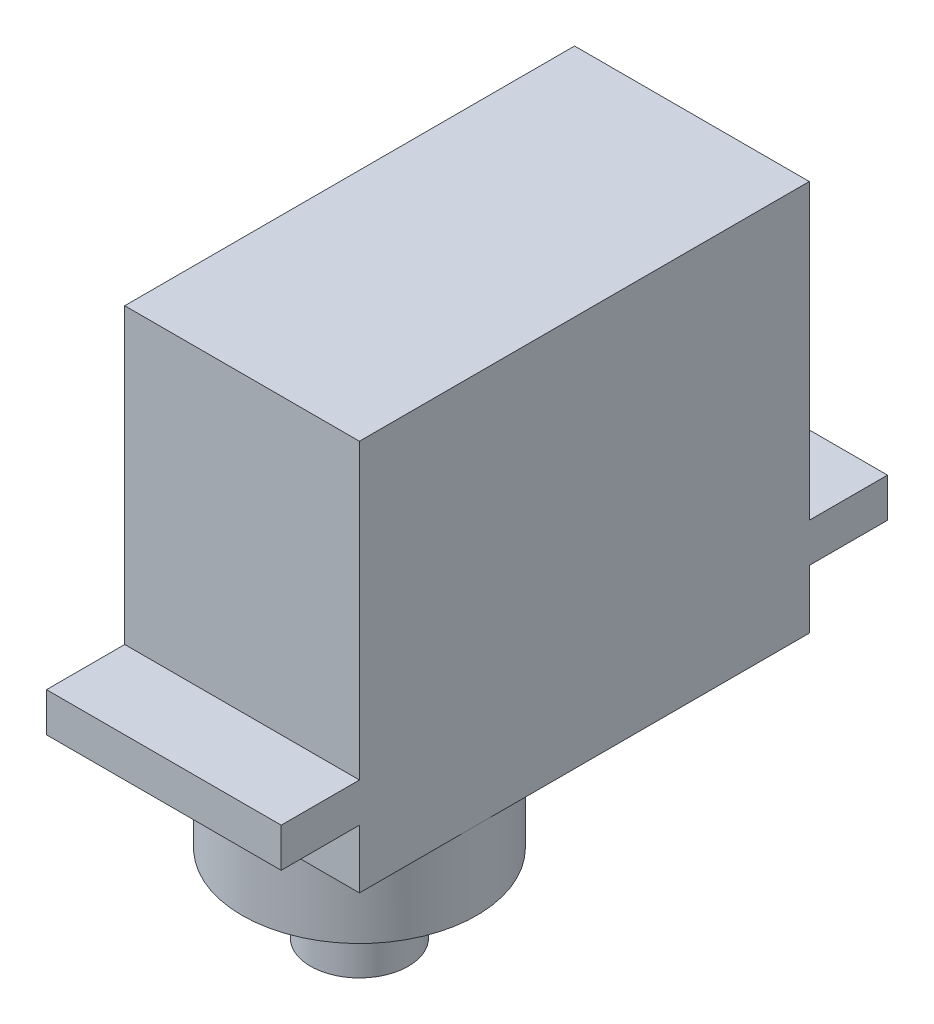
ISO-10303-21;
HEADER;
FILE_DESCRIPTION(('STEP AP214'),'2;1');
FILE_NAME('part.step','',(''),(''),'','','');
FILE_SCHEMA(('AUTOMOTIVE_DESIGN { 1 0 10303 214 1 1 1 1 }'));
ENDSEC;
DATA;
#1=APPLICATION_CONTEXT('core data for automotive mechanical design processes');
#2=APPLICATION_PROTOCOL_DEFINITION('international standard','automotive_design',2000,#1);
#3=PRODUCT_CONTEXT('',#1,'mechanical');
#4=PRODUCT('Part','Part','',(#3));
#5=PRODUCT_RELATED_PRODUCT_CATEGORY('part','',(#4));
#6=PRODUCT_DEFINITION_FORMATION('','',#4);
#7=PRODUCT_DEFINITION_CONTEXT('part definition',#1,'design');
#8=PRODUCT_DEFINITION('design','',#6,#7);
#9=PRODUCT_DEFINITION_SHAPE('','',#8);
#10=(LENGTH_UNIT() NAMED_UNIT(*) SI_UNIT(.MILLI.,.METRE.));
#11=(NAMED_UNIT(*) PLANE_ANGLE_UNIT() SI_UNIT($,.RADIAN.));
#12=(NAMED_UNIT(*) SI_UNIT($,.STERADIAN.) SOLID_ANGLE_UNIT());
#13=UNCERTAINTY_MEASURE_WITH_UNIT(LENGTH_MEASURE(1.E-05),#10,'distance_accuracy_value','');
#14=(GEOMETRIC_REPRESENTATION_CONTEXT(3) GLOBAL_UNCERTAINTY_ASSIGNED_CONTEXT((#13)) GLOBAL_UNIT_ASSIGNED_CONTEXT((#10,
#11,#12)) REPRESENTATION_CONTEXT('',''));
#15=CARTESIAN_POINT('',(0.,0.,0.));
#16=DIRECTION('',(0.,0.,1.));
#17=DIRECTION('',(1.,0.,0.));
#18=AXIS2_PLACEMENT_3D('',#15,#16,#17);
#19=CARTESIAN_POINT('',(-6.,-5.,-11.5));
#20=DIRECTION('',(0.,0.,-1.));
#21=DIRECTION('',(-1.,0.,0.));
#22=AXIS2_PLACEMENT_3D('',#19,#20,#21);
#23=PLANE('',#22);
#24=DIRECTION('',(0.,1.,0.));
#25=VECTOR('',#24,1.);
#26=CARTESIAN_POINT('',(6.,-5.,-11.5));
#27=LINE('',#26,#25);
#28=CARTESIAN_POINT('',(6.,0.,-11.5));
#29=VERTEX_POINT('',#28);
#30=CARTESIAN_POINT('',(6.,15.,-11.5));
#31=VERTEX_POINT('',#30);
#32=EDGE_CURVE('E63',#29,#31,#27,.T.);
#33=ORIENTED_EDGE('',*,*,#32,.F.);
#34=DIRECTION('',(-1.,0.,0.));
#35=VECTOR('',#34,1.);
#36=CARTESIAN_POINT('',(-6.,0.,-11.5));
#37=LINE('',#36,#35);
#38=CARTESIAN_POINT('',(-6.,0.,-11.5));
#39=VERTEX_POINT('',#38);
#40=EDGE_CURVE('E192',#29,#39,#37,.T.);
#41=ORIENTED_EDGE('',*,*,#40,.T.);
#42=DIRECTION('',(0.,1.,0.));
#43=VECTOR('',#42,1.);
#44=CARTESIAN_POINT('',(-6.,-5.,-11.5));
#45=LINE('',#44,#43);
#46=CARTESIAN_POINT('',(-6.,15.,-11.5));
#47=VERTEX_POINT('',#46);
#48=EDGE_CURVE('E166',#39,#47,#45,.T.);
#49=ORIENTED_EDGE('',*,*,#48,.T.);
#50=DIRECTION('',(-1.,0.,0.));
#51=VECTOR('',#50,1.);
#52=CARTESIAN_POINT('',(-6.,15.,-11.5));
#53=LINE('',#52,#51);
#54=EDGE_CURVE('E248',#31,#47,#53,.T.);
#55=ORIENTED_EDGE('',*,*,#54,.F.);
#56=EDGE_LOOP('',(#33,#41,#49,#55));
#57=FACE_BOUND('',#56,.T.);
#58=ADVANCED_FACE('F45',(#57),#23,.T.);
#59=CARTESIAN_POINT('',(-6.,-5.,11.5));
#60=DIRECTION('',(0.,0.,1.));
#61=DIRECTION('',(1.,0.,0.));
#62=AXIS2_PLACEMENT_3D('',#59,#60,#61);
#63=PLANE('',#62);
#64=DIRECTION('',(0.,1.,0.));
#65=VECTOR('',#64,1.);
#66=CARTESIAN_POINT('',(6.,-5.,11.5));
#67=LINE('',#66,#65);
#68=CARTESIAN_POINT('',(6.,-5.,11.5));
#69=VERTEX_POINT('',#68);
#70=CARTESIAN_POINT('',(6.,-2.,11.5));
#71=VERTEX_POINT('',#70);
#72=EDGE_CURVE('E269',#69,#71,#67,.T.);
#73=ORIENTED_EDGE('',*,*,#72,.T.);
#74=DIRECTION('',(-1.,0.,0.));
#75=VECTOR('',#74,1.);
#76=CARTESIAN_POINT('',(-6.,-2.,11.5));
#77=LINE('',#76,#75);
#78=CARTESIAN_POINT('',(-6.,-2.,11.5));
#79=VERTEX_POINT('',#78);
#80=EDGE_CURVE('E208',#71,#79,#77,.T.);
#81=ORIENTED_EDGE('',*,*,#80,.T.);
#82=DIRECTION('',(0.,1.,0.));
#83=VECTOR('',#82,1.);
#84=CARTESIAN_POINT('',(-6.,-5.,11.5));
#85=LINE('',#84,#83);
#86=CARTESIAN_POINT('',(-6.,-5.,11.5));
#87=VERTEX_POINT('',#86);
#88=EDGE_CURVE('E273',#87,#79,#85,.T.);
#89=ORIENTED_EDGE('',*,*,#88,.F.);
#90=DIRECTION('',(1.,0.,0.));
#91=VECTOR('',#90,1.);
#92=CARTESIAN_POINT('',(-6.,-5.,11.5));
#93=LINE('',#92,#91);
#94=CARTESIAN_POINT('',(0.,-5.,11.5));
#95=VERTEX_POINT('',#94);
#96=EDGE_CURVE('E266',#87,#95,#93,.T.);
#97=ORIENTED_EDGE('',*,*,#96,.T.);
#98=EDGE_CURVE('E265',#95,#69,#93,.T.);
#99=ORIENTED_EDGE('',*,*,#98,.T.);
#100=EDGE_LOOP('',(#73,#81,#89,#97,#99));
#101=FACE_BOUND('',#100,.T.);
#102=ADVANCED_FACE('F310',(#101),#63,.T.);
#103=CARTESIAN_POINT('',(0.,-5.,0.));
#104=DIRECTION('',(0.,1.,0.));
#105=DIRECTION('',(0.,0.,1.));
#106=AXIS2_PLACEMENT_3D('',#103,#104,#105);
#107=PLANE('',#106);
#108=CARTESIAN_POINT('',(0.,-5.,-0.992671740940215));
#109=DIRECTION('',(0.,-1.,0.));
#110=DIRECTION('',(0.,0.,-1.));
#111=AXIS2_PLACEMENT_3D('',#108,#109,#110);
#112=CIRCLE('',#111,1.64411257093235);
#113=CARTESIAN_POINT('',(-1.49592238520763,-5.,-0.31052632877907));
#114=VERTEX_POINT('',#113);
#115=CARTESIAN_POINT('',(1.49592238520763,-5.,-0.31052632877907));
#116=VERTEX_POINT('',#115);
#117=EDGE_CURVE('E227',#114,#116,#112,.T.);
#118=ORIENTED_EDGE('',*,*,#117,.F.);
#119=CARTESIAN_POINT('',(0.,-5.,5.5));
#120=DIRECTION('',(0.,-1.,0.));
#121=DIRECTION('',(0.,0.,-1.));
#122=AXIS2_PLACEMENT_3D('',#119,#120,#121);
#123=CIRCLE('',#122,6.);
#124=CARTESIAN_POINT('',(-6.,-5.,5.5));
#125=VERTEX_POINT('',#124);
#126=EDGE_CURVE('E239',#125,#114,#123,.T.);
#127=ORIENTED_EDGE('',*,*,#126,.F.);
#128=DIRECTION('',(0.,0.,1.));
#129=VECTOR('',#128,1.);
#130=CARTESIAN_POINT('',(-6.,-5.,-11.5));
#131=LINE('',#130,#129);
#132=CARTESIAN_POINT('',(-6.,-5.,-11.5));
#133=VERTEX_POINT('',#132);
#134=EDGE_CURVE('E263',#133,#125,#131,.T.);
#135=ORIENTED_EDGE('',*,*,#134,.F.);
#136=DIRECTION('',(-1.,0.,0.));
#137=VECTOR('',#136,1.);
#138=CARTESIAN_POINT('',(-6.,-5.,-11.5));
#139=LINE('',#138,#137);
#140=CARTESIAN_POINT('',(6.,-5.,-11.5));
#141=VERTEX_POINT('',#140);
#142=EDGE_CURVE('E160',#141,#133,#139,.T.);
#143=ORIENTED_EDGE('',*,*,#142,.F.);
#144=DIRECTION('',(0.,0.,-1.));
#145=VECTOR('',#144,1.);
#146=CARTESIAN_POINT('',(6.,-5.,-11.5));
#147=LINE('',#146,#145);
#148=CARTESIAN_POINT('',(6.,-5.,5.5));
#149=VERTEX_POINT('',#148);
#150=EDGE_CURVE('E257',#149,#141,#147,.T.);
#151=ORIENTED_EDGE('',*,*,#150,.F.);
#152=EDGE_CURVE('E56',#116,#149,#123,.T.);
#153=ORIENTED_EDGE('',*,*,#152,.F.);
#154=EDGE_LOOP('',(#118,#127,#135,#143,#151,#153));
#155=FACE_BOUND('',#154,.T.);
#156=ADVANCED_FACE('F294',(#155),#107,.F.);
#157=EDGE_CURVE('E11',#149,#95,#123,.T.);
#158=ORIENTED_EDGE('',*,*,#157,.F.);
#159=EDGE_CURVE('E258',#69,#149,#147,.T.);
#160=ORIENTED_EDGE('',*,*,#159,.F.);
#161=ORIENTED_EDGE('',*,*,#98,.F.);
#162=EDGE_LOOP('',(#158,#160,#161));
#163=FACE_BOUND('',#162,.T.);
#164=ADVANCED_FACE('F307',(#163),#107,.F.);
#165=CARTESIAN_POINT('',(6.,-5.,-11.5));
#166=DIRECTION('',(1.,0.,0.));
#167=DIRECTION('',(0.,0.,-1.));
#168=AXIS2_PLACEMENT_3D('',#165,#166,#167);
#169=PLANE('',#168);
#170=CARTESIAN_POINT('',(6.,-2.,-11.5));
#171=VERTEX_POINT('',#170);
#172=EDGE_CURVE('E49',#141,#171,#27,.T.);
#173=ORIENTED_EDGE('',*,*,#172,.T.);
#174=DIRECTION('',(0.,0.,1.));
#175=VECTOR('',#174,1.);
#176=CARTESIAN_POINT('',(6.,-2.,-11.5));
#177=LINE('',#176,#175);
#178=CARTESIAN_POINT('',(6.,-2.,-15.5));
#179=VERTEX_POINT('',#178);
#180=EDGE_CURVE('E174',#179,#171,#177,.T.);
#181=ORIENTED_EDGE('',*,*,#180,.F.);
#182=DIRECTION('',(0.,1.,0.));
#183=VECTOR('',#182,1.);
#184=CARTESIAN_POINT('',(6.,-2.,-15.5));
#185=LINE('',#184,#183);
#186=CARTESIAN_POINT('',(6.,0.,-15.5));
#187=VERTEX_POINT('',#186);
#188=EDGE_CURVE('E189',#179,#187,#185,.T.);
#189=ORIENTED_EDGE('',*,*,#188,.T.);
#190=DIRECTION('',(0.,0.,1.));
#191=VECTOR('',#190,1.);
#192=CARTESIAN_POINT('',(6.,0.,-11.5));
#193=LINE('',#192,#191);
#194=EDGE_CURVE('E183',#187,#29,#193,.T.);
#195=ORIENTED_EDGE('',*,*,#194,.T.);
#196=ORIENTED_EDGE('',*,*,#32,.T.);
#197=DIRECTION('',(0.,0.,-1.));
#198=VECTOR('',#197,1.);
#199=CARTESIAN_POINT('',(6.,15.,-11.5));
#200=LINE('',#199,#198);
#201=CARTESIAN_POINT('',(6.,15.,11.5));
#202=VERTEX_POINT('',#201);
#203=EDGE_CURVE('E245',#202,#31,#200,.T.);
#204=ORIENTED_EDGE('',*,*,#203,.F.);
#205=CARTESIAN_POINT('',(6.,0.,11.5));
#206=VERTEX_POINT('',#205);
#207=EDGE_CURVE('E272',#206,#202,#67,.T.);
#208=ORIENTED_EDGE('',*,*,#207,.F.);
#209=DIRECTION('',(0.,0.,-1.));
#210=VECTOR('',#209,1.);
#211=CARTESIAN_POINT('',(6.,0.,11.5));
#212=LINE('',#211,#210);
#213=CARTESIAN_POINT('',(6.,0.,15.5));
#214=VERTEX_POINT('',#213);
#215=EDGE_CURVE('E217',#214,#206,#212,.T.);
#216=ORIENTED_EDGE('',*,*,#215,.F.);
#217=DIRECTION('',(0.,1.,0.));
#218=VECTOR('',#217,1.);
#219=CARTESIAN_POINT('',(6.,-2.,15.5));
#220=LINE('',#219,#218);
#221=CARTESIAN_POINT('',(6.,-2.,15.5));
#222=VERTEX_POINT('',#221);
#223=EDGE_CURVE('E220',#222,#214,#220,.T.);
#224=ORIENTED_EDGE('',*,*,#223,.F.);
#225=DIRECTION('',(0.,0.,-1.));
#226=VECTOR('',#225,1.);
#227=CARTESIAN_POINT('',(6.,-2.,11.5));
#228=LINE('',#227,#226);
#229=EDGE_CURVE('E206',#222,#71,#228,.T.);
#230=ORIENTED_EDGE('',*,*,#229,.T.);
#231=ORIENTED_EDGE('',*,*,#72,.F.);
#232=ORIENTED_EDGE('',*,*,#159,.T.);
#233=ORIENTED_EDGE('',*,*,#150,.T.);
#234=EDGE_LOOP('',(#173,#181,#189,#195,#196,#204,#208,#216,#224,#230,#231,#232,#233));
#235=FACE_BOUND('',#234,.T.);
#236=ADVANCED_FACE('F47',(#235),#169,.T.);
#237=DIRECTION('',(-1.,0.,0.));
#238=VECTOR('',#237,1.);
#239=CARTESIAN_POINT('',(-6.,0.,11.5));
#240=LINE('',#239,#238);
#241=CARTESIAN_POINT('',(-6.,0.,11.5));
#242=VERTEX_POINT('',#241);
#243=EDGE_CURVE('E203',#206,#242,#240,.T.);
#244=ORIENTED_EDGE('',*,*,#243,.F.);
#245=ORIENTED_EDGE('',*,*,#207,.T.);
#246=DIRECTION('',(1.,0.,0.));
#247=VECTOR('',#246,1.);
#248=CARTESIAN_POINT('',(-6.,15.,11.5));
#249=LINE('',#248,#247);
#250=CARTESIAN_POINT('',(-6.,15.,11.5));
#251=VERTEX_POINT('',#250);
#252=EDGE_CURVE('E254',#251,#202,#249,.T.);
#253=ORIENTED_EDGE('',*,*,#252,.F.);
#254=EDGE_CURVE('E165',#242,#251,#85,.T.);
#255=ORIENTED_EDGE('',*,*,#254,.F.);
#256=EDGE_LOOP('',(#244,#245,#253,#255));
#257=FACE_BOUND('',#256,.T.);
#258=ADVANCED_FACE('F285',(#257),#63,.T.);
#259=CARTESIAN_POINT('',(-6.,-5.,-11.5));
#260=DIRECTION('',(-1.,0.,0.));
#261=DIRECTION('',(0.,0.,1.));
#262=AXIS2_PLACEMENT_3D('',#259,#260,#261);
#263=PLANE('',#262);
#264=ORIENTED_EDGE('',*,*,#88,.T.);
#265=DIRECTION('',(0.,0.,1.));
#266=VECTOR('',#265,1.);
#267=CARTESIAN_POINT('',(-6.,-2.,11.5));
#268=LINE('',#267,#266);
#269=CARTESIAN_POINT('',(-6.,-2.,15.5));
#270=VERTEX_POINT('',#269);
#271=EDGE_CURVE('E199',#79,#270,#268,.T.);
#272=ORIENTED_EDGE('',*,*,#271,.T.);
#273=DIRECTION('',(0.,1.,0.));
#274=VECTOR('',#273,1.);
#275=CARTESIAN_POINT('',(-6.,-2.,15.5));
#276=LINE('',#275,#274);
#277=CARTESIAN_POINT('',(-6.,0.,15.5));
#278=VERTEX_POINT('',#277);
#279=EDGE_CURVE('E211',#270,#278,#276,.T.);
#280=ORIENTED_EDGE('',*,*,#279,.T.);
#281=DIRECTION('',(0.,0.,1.));
#282=VECTOR('',#281,1.);
#283=CARTESIAN_POINT('',(-6.,0.,11.5));
#284=LINE('',#283,#282);
#285=EDGE_CURVE('E196',#242,#278,#284,.T.);
#286=ORIENTED_EDGE('',*,*,#285,.F.);
#287=ORIENTED_EDGE('',*,*,#254,.T.);
#288=DIRECTION('',(0.,0.,1.));
#289=VECTOR('',#288,1.);
#290=CARTESIAN_POINT('',(-6.,15.,-11.5));
#291=LINE('',#290,#289);
#292=EDGE_CURVE('E251',#47,#251,#291,.T.);
#293=ORIENTED_EDGE('',*,*,#292,.F.);
#294=ORIENTED_EDGE('',*,*,#48,.F.);
#295=DIRECTION('',(0.,0.,-1.));
#296=VECTOR('',#295,1.);
#297=CARTESIAN_POINT('',(-6.,0.,-11.5));
#298=LINE('',#297,#296);
#299=CARTESIAN_POINT('',(-6.,0.,-15.5));
#300=VERTEX_POINT('',#299);
#301=EDGE_CURVE('E190',#39,#300,#298,.T.);
#302=ORIENTED_EDGE('',*,*,#301,.T.);
#303=DIRECTION('',(0.,1.,0.));
#304=VECTOR('',#303,1.);
#305=CARTESIAN_POINT('',(-6.,-2.,-15.5));
#306=LINE('',#305,#304);
#307=CARTESIAN_POINT('',(-6.,-2.,-15.5));
#308=VERTEX_POINT('',#307);
#309=EDGE_CURVE('E180',#308,#300,#306,.T.);
#310=ORIENTED_EDGE('',*,*,#309,.F.);
#311=DIRECTION('',(0.,0.,-1.));
#312=VECTOR('',#311,1.);
#313=CARTESIAN_POINT('',(-6.,-2.,-11.5));
#314=LINE('',#313,#312);
#315=CARTESIAN_POINT('',(-6.,-2.,-11.5));
#316=VERTEX_POINT('',#315);
#317=EDGE_CURVE('E171',#316,#308,#314,.T.);
#318=ORIENTED_EDGE('',*,*,#317,.F.);
#319=EDGE_CURVE('E157',#133,#316,#45,.T.);
#320=ORIENTED_EDGE('',*,*,#319,.F.);
#321=ORIENTED_EDGE('',*,*,#134,.T.);
#322=EDGE_CURVE('E262',#125,#87,#131,.T.);
#323=ORIENTED_EDGE('',*,*,#322,.T.);
#324=EDGE_LOOP('',(#264,#272,#280,#286,#287,#293,#294,#302,#310,#318,#320,#321,#323));
#325=FACE_BOUND('',#324,.T.);
#326=ADVANCED_FACE('F177',(#325),#263,.T.);
#327=DIRECTION('',(-1.,0.,0.));
#328=VECTOR('',#327,1.);
#329=CARTESIAN_POINT('',(-6.,-2.,-11.5));
#330=LINE('',#329,#328);
#331=EDGE_CURVE('E71',#171,#316,#330,.T.);
#332=ORIENTED_EDGE('',*,*,#331,.F.);
#333=ORIENTED_EDGE('',*,*,#172,.F.);
#334=ORIENTED_EDGE('',*,*,#142,.T.);
#335=ORIENTED_EDGE('',*,*,#319,.T.);
#336=EDGE_LOOP('',(#332,#333,#334,#335));
#337=FACE_BOUND('',#336,.T.);
#338=ADVANCED_FACE('F158',(#337),#23,.T.);
#339=EDGE_CURVE('E54',#95,#125,#123,.T.);
#340=ORIENTED_EDGE('',*,*,#339,.F.);
#341=ORIENTED_EDGE('',*,*,#96,.F.);
#342=ORIENTED_EDGE('',*,*,#322,.F.);
#343=EDGE_LOOP('',(#340,#341,#342));
#344=FACE_BOUND('',#343,.T.);
#345=ADVANCED_FACE('F304',(#344),#107,.F.);
#346=CARTESIAN_POINT('',(0.,15.,0.));
#347=DIRECTION('',(0.,1.,0.));
#348=DIRECTION('',(0.,0.,1.));
#349=AXIS2_PLACEMENT_3D('',#346,#347,#348);
#350=PLANE('',#349);
#351=ORIENTED_EDGE('',*,*,#203,.T.);
#352=ORIENTED_EDGE('',*,*,#54,.T.);
#353=ORIENTED_EDGE('',*,*,#292,.T.);
#354=ORIENTED_EDGE('',*,*,#252,.T.);
#355=EDGE_LOOP('',(#351,#352,#353,#354));
#356=FACE_BOUND('',#355,.T.);
#357=ADVANCED_FACE('F283',(#356),#350,.T.);
#358=CARTESIAN_POINT('',(0.,-9.,-0.992671740940215));
#359=DIRECTION('',(0.,1.,0.));
#360=DIRECTION('',(0.,0.,1.));
#361=AXIS2_PLACEMENT_3D('',#358,#359,#360);
#362=CYLINDRICAL_SURFACE('',#361,1.64411257093235);
#363=ORIENTED_EDGE('',*,*,#117,.T.);
#364=DIRECTION('',(0.,1.,0.));
#365=VECTOR('',#364,1.);
#366=CARTESIAN_POINT('',(1.49592238520763,-9.,-0.31052632877907));
#367=LINE('',#366,#365);
#368=CARTESIAN_POINT('',(1.49592238520763,-9.,-0.31052632877907));
#369=VERTEX_POINT('',#368);
#370=EDGE_CURVE('E242',#369,#116,#367,.T.);
#371=ORIENTED_EDGE('',*,*,#370,.F.);
#372=CARTESIAN_POINT('',(0.,-9.,-0.992671740940215));
#373=DIRECTION('',(0.,-1.,0.));
#374=DIRECTION('',(0.,0.,-1.));
#375=AXIS2_PLACEMENT_3D('',#372,#373,#374);
#376=CIRCLE('',#375,1.64411257093235);
#377=CARTESIAN_POINT('',(-1.49592238520763,-9.,-0.31052632877907));
#378=VERTEX_POINT('',#377);
#379=EDGE_CURVE('E230',#378,#369,#376,.T.);
#380=ORIENTED_EDGE('',*,*,#379,.F.);
#381=DIRECTION('',(0.,1.,0.));
#382=VECTOR('',#381,1.);
#383=CARTESIAN_POINT('',(-1.49592238520763,-9.,-0.31052632877907));
#384=LINE('',#383,#382);
#385=EDGE_CURVE('E235',#378,#114,#384,.T.);
#386=ORIENTED_EDGE('',*,*,#385,.T.);
#387=EDGE_LOOP('',(#363,#371,#380,#386));
#388=FACE_BOUND('',#387,.T.);
#389=ADVANCED_FACE('F351',(#388),#362,.T.);
#390=CARTESIAN_POINT('',(0.,-9.,5.5));
#391=DIRECTION('',(0.,1.,0.));
#392=DIRECTION('',(0.,0.,1.));
#393=AXIS2_PLACEMENT_3D('',#390,#391,#392);
#394=CYLINDRICAL_SURFACE('',#393,6.);
#395=ORIENTED_EDGE('',*,*,#152,.T.);
#396=ORIENTED_EDGE('',*,*,#157,.T.);
#397=ORIENTED_EDGE('',*,*,#339,.T.);
#398=ORIENTED_EDGE('',*,*,#126,.T.);
#399=ORIENTED_EDGE('',*,*,#385,.F.);
#400=CARTESIAN_POINT('',(0.,-9.,5.5));
#401=DIRECTION('',(0.,-1.,0.));
#402=DIRECTION('',(0.,0.,-1.));
#403=AXIS2_PLACEMENT_3D('',#400,#401,#402);
#404=CIRCLE('',#403,6.);
#405=EDGE_CURVE('E233',#369,#378,#404,.T.);
#406=ORIENTED_EDGE('',*,*,#405,.F.);
#407=ORIENTED_EDGE('',*,*,#370,.T.);
#408=EDGE_LOOP('',(#395,#396,#397,#398,#399,#406,#407));
#409=FACE_BOUND('',#408,.T.);
#410=ADVANCED_FACE('F299',(#409),#394,.T.);
#411=CARTESIAN_POINT('',(0.,-9.,2.25366412952989));
#412=DIRECTION('',(0.,-1.,0.));
#413=DIRECTION('',(0.,0.,-1.));
#414=AXIS2_PLACEMENT_3D('',#411,#412,#413);
#415=PLANE('',#414);
#416=CARTESIAN_POINT('',(0.,-9.,5.5));
#417=DIRECTION('',(0.,-1.,0.));
#418=DIRECTION('',(0.,0.,-1.));
#419=AXIS2_PLACEMENT_3D('',#416,#417,#418);
#420=CIRCLE('',#419,2.5);
#421=CARTESIAN_POINT('',(0.,-9.,3.));
#422=VERTEX_POINT('',#421);
#423=EDGE_CURVE('E222',#422,#422,#420,.T.);
#424=ORIENTED_EDGE('',*,*,#423,.F.);
#425=EDGE_LOOP('',(#424));
#426=FACE_BOUND('',#425,.T.);
#427=ORIENTED_EDGE('',*,*,#379,.T.);
#428=ORIENTED_EDGE('',*,*,#405,.T.);
#429=EDGE_LOOP('',(#427,#428));
#430=FACE_BOUND('',#429,.T.);
#431=ADVANCED_FACE('F357',(#426,#430),#415,.T.);
#432=CARTESIAN_POINT('',(0.,-13.,5.5));
#433=DIRECTION('',(0.,1.,0.));
#434=DIRECTION('',(0.,0.,1.));
#435=AXIS2_PLACEMENT_3D('',#432,#433,#434);
#436=CYLINDRICAL_SURFACE('',#435,2.5);
#437=CARTESIAN_POINT('',(0.,-13.,5.5));
#438=DIRECTION('',(0.,-1.,0.));
#439=DIRECTION('',(0.,0.,-1.));
#440=AXIS2_PLACEMENT_3D('',#437,#438,#439);
#441=CIRCLE('',#440,2.5);
#442=CARTESIAN_POINT('',(0.,-13.,3.));
#443=VERTEX_POINT('',#442);
#444=EDGE_CURVE('E224',#443,#443,#441,.T.);
#445=ORIENTED_EDGE('',*,*,#444,.F.);
#446=EDGE_LOOP('',(#445));
#447=FACE_BOUND('',#446,.T.);
#448=ORIENTED_EDGE('',*,*,#423,.T.);
#449=EDGE_LOOP('',(#448));
#450=FACE_BOUND('',#449,.T.);
#451=ADVANCED_FACE('F360',(#447,#450),#436,.T.);
#452=CARTESIAN_POINT('',(0.,-13.,5.5));
#453=DIRECTION('',(0.,-1.,0.));
#454=DIRECTION('',(0.,0.,-1.));
#455=AXIS2_PLACEMENT_3D('',#452,#453,#454);
#456=PLANE('',#455);
#457=ORIENTED_EDGE('',*,*,#444,.T.);
#458=EDGE_LOOP('',(#457));
#459=FACE_BOUND('',#458,.T.);
#460=ADVANCED_FACE('F364',(#459),#456,.T.);
#461=CARTESIAN_POINT('',(-6.,-2.,15.5));
#462=DIRECTION('',(0.,0.,1.));
#463=DIRECTION('',(1.,0.,0.));
#464=AXIS2_PLACEMENT_3D('',#461,#462,#463);
#465=PLANE('',#464);
#466=DIRECTION('',(1.,0.,0.));
#467=VECTOR('',#466,1.);
#468=CARTESIAN_POINT('',(-6.,0.,15.5));
#469=LINE('',#468,#467);
#470=EDGE_CURVE('E214',#278,#214,#469,.T.);
#471=ORIENTED_EDGE('',*,*,#470,.F.);
#472=ORIENTED_EDGE('',*,*,#279,.F.);
#473=DIRECTION('',(1.,0.,0.));
#474=VECTOR('',#473,1.);
#475=CARTESIAN_POINT('',(-6.,-2.,15.5));
#476=LINE('',#475,#474);
#477=EDGE_CURVE('E202',#270,#222,#476,.T.);
#478=ORIENTED_EDGE('',*,*,#477,.T.);
#479=ORIENTED_EDGE('',*,*,#223,.T.);
#480=EDGE_LOOP('',(#471,#472,#478,#479));
#481=FACE_BOUND('',#480,.T.);
#482=ADVANCED_FACE('F318',(#481),#465,.T.);
#483=CARTESIAN_POINT('',(0.,-2.,0.));
#484=DIRECTION('',(0.,1.,0.));
#485=DIRECTION('',(0.,0.,1.));
#486=AXIS2_PLACEMENT_3D('',#483,#484,#485);
#487=PLANE('',#486);
#488=ORIENTED_EDGE('',*,*,#271,.F.);
#489=ORIENTED_EDGE('',*,*,#80,.F.);
#490=ORIENTED_EDGE('',*,*,#229,.F.);
#491=ORIENTED_EDGE('',*,*,#477,.F.);
#492=EDGE_LOOP('',(#488,#489,#490,#491));
#493=FACE_BOUND('',#492,.T.);
#494=ADVANCED_FACE('F314',(#493),#487,.F.);
#495=CARTESIAN_POINT('',(0.,0.,0.));
#496=DIRECTION('',(0.,1.,0.));
#497=DIRECTION('',(0.,0.,1.));
#498=AXIS2_PLACEMENT_3D('',#495,#496,#497);
#499=PLANE('',#498);
#500=ORIENTED_EDGE('',*,*,#285,.T.);
#501=ORIENTED_EDGE('',*,*,#470,.T.);
#502=ORIENTED_EDGE('',*,*,#215,.T.);
#503=ORIENTED_EDGE('',*,*,#243,.T.);
#504=EDGE_LOOP('',(#500,#501,#502,#503));
#505=FACE_BOUND('',#504,.T.);
#506=ADVANCED_FACE('F320',(#505),#499,.T.);
#507=CARTESIAN_POINT('',(-6.,-2.,-15.5));
#508=DIRECTION('',(0.,0.,1.));
#509=DIRECTION('',(1.,0.,0.));
#510=AXIS2_PLACEMENT_3D('',#507,#508,#509);
#511=PLANE('',#510);
#512=DIRECTION('',(1.,0.,0.));
#513=VECTOR('',#512,1.);
#514=CARTESIAN_POINT('',(-6.,0.,-15.5));
#515=LINE('',#514,#513);
#516=EDGE_CURVE('E181',#300,#187,#515,.T.);
#517=ORIENTED_EDGE('',*,*,#516,.T.);
#518=ORIENTED_EDGE('',*,*,#188,.F.);
#519=DIRECTION('',(1.,0.,0.));
#520=VECTOR('',#519,1.);
#521=CARTESIAN_POINT('',(-6.,-2.,-15.5));
#522=LINE('',#521,#520);
#523=EDGE_CURVE('E187',#308,#179,#522,.T.);
#524=ORIENTED_EDGE('',*,*,#523,.F.);
#525=ORIENTED_EDGE('',*,*,#309,.T.);
#526=EDGE_LOOP('',(#517,#518,#524,#525));
#527=FACE_BOUND('',#526,.T.);
#528=ADVANCED_FACE('F322',(#527),#511,.F.);
#529=CARTESIAN_POINT('',(0.,-2.,0.));
#530=DIRECTION('',(0.,1.,0.));
#531=DIRECTION('',(0.,0.,-1.));
#532=AXIS2_PLACEMENT_3D('',#529,#530,#531);
#533=PLANE('',#532);
#534=ORIENTED_EDGE('',*,*,#317,.T.);
#535=ORIENTED_EDGE('',*,*,#523,.T.);
#536=ORIENTED_EDGE('',*,*,#180,.T.);
#537=ORIENTED_EDGE('',*,*,#331,.T.);
#538=EDGE_LOOP('',(#534,#535,#536,#537));
#539=FACE_BOUND('',#538,.T.);
#540=ADVANCED_FACE('F170',(#539),#533,.F.);
#541=CARTESIAN_POINT('',(0.,0.,0.));
#542=DIRECTION('',(0.,1.,0.));
#543=DIRECTION('',(0.,0.,-1.));
#544=AXIS2_PLACEMENT_3D('',#541,#542,#543);
#545=PLANE('',#544);
#546=ORIENTED_EDGE('',*,*,#301,.F.);
#547=ORIENTED_EDGE('',*,*,#40,.F.);
#548=ORIENTED_EDGE('',*,*,#194,.F.);
#549=ORIENTED_EDGE('',*,*,#516,.F.);
#550=EDGE_LOOP('',(#546,#547,#548,#549));
#551=FACE_BOUND('',#550,.T.);
#552=ADVANCED_FACE('F407',(#551),#545,.T.);
#553=CLOSED_SHELL('',(#58,#102,#156,#164,#236,#258,#326,#338,#345,#357,#389,#410,#431,#451,#460,
#482,#494,#506,#528,#540,#552));
#554=MANIFOLD_SOLID_BREP('B2',#553);
#555=ADVANCED_BREP_SHAPE_REPRESENTATION('',(#18,#554),#14);
#556=SHAPE_DEFINITION_REPRESENTATION(#9,#555);
ENDSEC;
END-ISO-10303-21;
